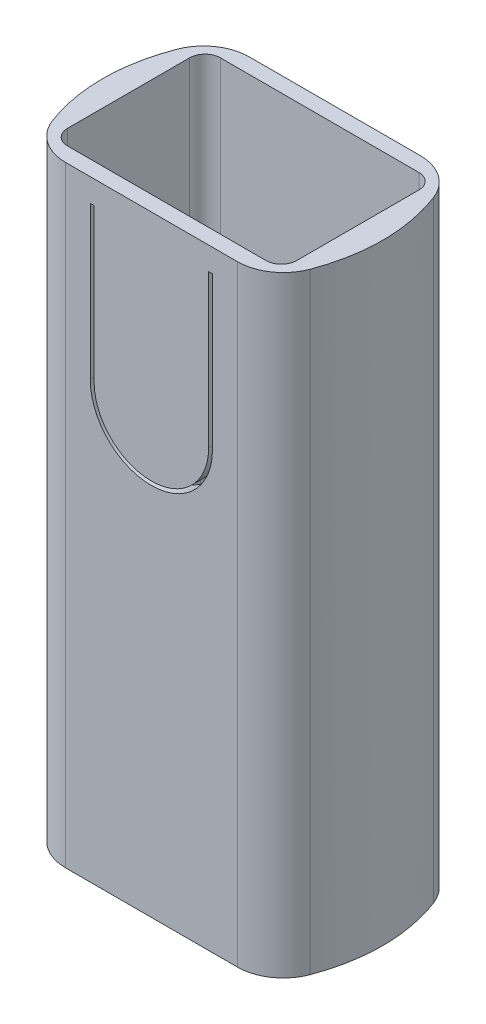
ISO-10303-21;
HEADER;
FILE_DESCRIPTION(('STEP AP214'),'2;1');
FILE_NAME('part.step','',(''),(''),'','','');
FILE_SCHEMA(('AUTOMOTIVE_DESIGN { 1 0 10303 214 1 1 1 1 }'));
ENDSEC;
DATA;
#1=APPLICATION_CONTEXT('core data for automotive mechanical design processes');
#2=APPLICATION_PROTOCOL_DEFINITION('international standard','automotive_design',2000,#1);
#3=PRODUCT_CONTEXT('',#1,'mechanical');
#4=PRODUCT('Part','Part','',(#3));
#5=PRODUCT_RELATED_PRODUCT_CATEGORY('part','',(#4));
#6=PRODUCT_DEFINITION_FORMATION('','',#4);
#7=PRODUCT_DEFINITION_CONTEXT('part definition',#1,'design');
#8=PRODUCT_DEFINITION('design','',#6,#7);
#9=PRODUCT_DEFINITION_SHAPE('','',#8);
#10=(LENGTH_UNIT() NAMED_UNIT(*) SI_UNIT(.MILLI.,.METRE.));
#11=(NAMED_UNIT(*) PLANE_ANGLE_UNIT() SI_UNIT($,.RADIAN.));
#12=(NAMED_UNIT(*) SI_UNIT($,.STERADIAN.) SOLID_ANGLE_UNIT());
#13=UNCERTAINTY_MEASURE_WITH_UNIT(LENGTH_MEASURE(1.E-05),#10,'distance_accuracy_value','');
#14=(GEOMETRIC_REPRESENTATION_CONTEXT(3) GLOBAL_UNCERTAINTY_ASSIGNED_CONTEXT((#13)) GLOBAL_UNIT_ASSIGNED_CONTEXT((#10,
#11,#12)) REPRESENTATION_CONTEXT('',''));
#15=CARTESIAN_POINT('',(0.,0.,0.));
#16=DIRECTION('',(0.,0.,1.));
#17=DIRECTION('',(1.,0.,0.));
#18=AXIS2_PLACEMENT_3D('',#15,#16,#17);
#19=CARTESIAN_POINT('',(-15.0000000000007,138.,7.9999999999995));
#20=DIRECTION('',(1.,0.,0.));
#21=DIRECTION('',(0.,0.,-1.));
#22=AXIS2_PLACEMENT_3D('',#19,#20,#21);
#23=PLANE('',#22);
#24=DIRECTION('',(0.,0.,1.));
#25=VECTOR('',#24,1.);
#26=CARTESIAN_POINT('',(-15.0000000000007,58.,7.9999999999995));
#27=LINE('',#26,#25);
#28=CARTESIAN_POINT('',(-15.0000000000007,58.,-6.93791118344121));
#29=VERTEX_POINT('',#28);
#30=CARTESIAN_POINT('',(-15.0000000000007,58.,7.9999999999995));
#31=VERTEX_POINT('',#30);
#32=EDGE_CURVE('E368',#29,#31,#27,.T.);
#33=ORIENTED_EDGE('',*,*,#32,.F.);
#34=DIRECTION('',(0.,-1.,0.));
#35=VECTOR('',#34,1.);
#36=CARTESIAN_POINT('',(-14.9999999999993,115.,-6.93791118344122));
#37=LINE('',#36,#35);
#38=CARTESIAN_POINT('',(-14.9999999999993,115.,-6.93791118344122));
#39=VERTEX_POINT('',#38);
#40=EDGE_CURVE('E301',#39,#29,#37,.T.);
#41=ORIENTED_EDGE('',*,*,#40,.F.);
#42=DIRECTION('',(0.,0.,1.));
#43=VECTOR('',#42,1.);
#44=CARTESIAN_POINT('',(-15.0000000000007,115.,7.9999999999995));
#45=LINE('',#44,#43);
#46=CARTESIAN_POINT('',(-14.9999999999993,115.,-8.0000000000005));
#47=VERTEX_POINT('',#46);
#48=EDGE_CURVE('E498',#47,#39,#45,.T.);
#49=ORIENTED_EDGE('',*,*,#48,.F.);
#50=DIRECTION('',(0.,-1.,0.));
#51=VECTOR('',#50,1.);
#52=CARTESIAN_POINT('',(-15.0000000000007,138.,-8.0000000000005));
#53=LINE('',#52,#51);
#54=CARTESIAN_POINT('',(-15.0000000000007,138.,-8.0000000000005));
#55=VERTEX_POINT('',#54);
#56=EDGE_CURVE('E382',#55,#47,#53,.T.);
#57=ORIENTED_EDGE('',*,*,#56,.F.);
#58=DIRECTION('',(0.,0.,1.));
#59=VECTOR('',#58,1.);
#60=CARTESIAN_POINT('',(-15.0000000000007,138.,7.9999999999995));
#61=LINE('',#60,#59);
#62=CARTESIAN_POINT('',(-15.0000000000007,138.,7.9999999999995));
#63=VERTEX_POINT('',#62);
#64=EDGE_CURVE('E352',#55,#63,#61,.T.);
#65=ORIENTED_EDGE('',*,*,#64,.T.);
#66=DIRECTION('',(0.,-1.,0.));
#67=VECTOR('',#66,1.);
#68=CARTESIAN_POINT('',(-15.0000000000007,138.,7.9999999999995));
#69=LINE('',#68,#67);
#70=EDGE_CURVE('E379',#63,#31,#69,.T.);
#71=ORIENTED_EDGE('',*,*,#70,.T.);
#72=EDGE_LOOP('',(#33,#41,#49,#57,#65,#71));
#73=FACE_BOUND('',#72,.T.);
#74=ADVANCED_FACE('F33',(#73),#23,.T.);
#75=CARTESIAN_POINT('',(14.9999999999993,138.,7.9999999999995));
#76=DIRECTION('',(-1.,0.,0.));
#77=DIRECTION('',(0.,0.,1.));
#78=AXIS2_PLACEMENT_3D('',#75,#76,#77);
#79=PLANE('',#78);
#80=DIRECTION('',(0.,0.,-1.));
#81=VECTOR('',#80,1.);
#82=CARTESIAN_POINT('',(14.9999999999993,115.,-10.0000000000005));
#83=LINE('',#82,#81);
#84=CARTESIAN_POINT('',(14.9999999999993,115.,-6.93791118344122));
#85=VERTEX_POINT('',#84);
#86=CARTESIAN_POINT('',(14.9999999999993,115.,-8.0000000000005));
#87=VERTEX_POINT('',#86);
#88=EDGE_CURVE('E316',#85,#87,#83,.T.);
#89=ORIENTED_EDGE('',*,*,#88,.F.);
#90=DIRECTION('',(0.,-1.,0.));
#91=VECTOR('',#90,1.);
#92=CARTESIAN_POINT('',(14.9999999999993,115.,-6.93791118344122));
#93=LINE('',#92,#91);
#94=CARTESIAN_POINT('',(14.9999999999993,58.,-6.93791118344122));
#95=VERTEX_POINT('',#94);
#96=EDGE_CURVE('E338',#85,#95,#93,.T.);
#97=ORIENTED_EDGE('',*,*,#96,.T.);
#98=DIRECTION('',(0.,0.,-1.));
#99=VECTOR('',#98,1.);
#100=CARTESIAN_POINT('',(14.9999999999993,58.,7.9999999999995));
#101=LINE('',#100,#99);
#102=CARTESIAN_POINT('',(14.9999999999993,58.,7.9999999999995));
#103=VERTEX_POINT('',#102);
#104=EDGE_CURVE('E362',#103,#95,#101,.T.);
#105=ORIENTED_EDGE('',*,*,#104,.F.);
#106=DIRECTION('',(0.,-1.,0.));
#107=VECTOR('',#106,1.);
#108=CARTESIAN_POINT('',(14.9999999999993,138.,7.9999999999995));
#109=LINE('',#108,#107);
#110=CARTESIAN_POINT('',(14.9999999999993,138.,7.9999999999995));
#111=VERTEX_POINT('',#110);
#112=EDGE_CURVE('E394',#111,#103,#109,.T.);
#113=ORIENTED_EDGE('',*,*,#112,.F.);
#114=DIRECTION('',(0.,0.,-1.));
#115=VECTOR('',#114,1.);
#116=CARTESIAN_POINT('',(14.9999999999993,138.,7.9999999999995));
#117=LINE('',#116,#115);
#118=CARTESIAN_POINT('',(14.9999999999993,138.,-8.0000000000005));
#119=VERTEX_POINT('',#118);
#120=EDGE_CURVE('E343',#111,#119,#117,.T.);
#121=ORIENTED_EDGE('',*,*,#120,.T.);
#122=DIRECTION('',(0.,-1.,0.));
#123=VECTOR('',#122,1.);
#124=CARTESIAN_POINT('',(14.9999999999993,138.,-8.0000000000005));
#125=LINE('',#124,#123);
#126=EDGE_CURVE('E391',#119,#87,#125,.T.);
#127=ORIENTED_EDGE('',*,*,#126,.T.);
#128=EDGE_LOOP('',(#89,#97,#105,#113,#121,#127));
#129=FACE_BOUND('',#128,.T.);
#130=ADVANCED_FACE('F551',(#129),#79,.T.);
#131=CARTESIAN_POINT('',(12.9999999999993,138.,-8.0000000000005));
#132=DIRECTION('',(0.,-1.,0.));
#133=DIRECTION('',(0.,0.,-1.));
#134=AXIS2_PLACEMENT_3D('',#131,#132,#133);
#135=CYLINDRICAL_SURFACE('',#134,2.);
#136=DIRECTION('',(0.,-1.,0.));
#137=VECTOR('',#136,1.);
#138=CARTESIAN_POINT('',(12.9999999999993,138.,-10.0000000000005));
#139=LINE('',#138,#137);
#140=CARTESIAN_POINT('',(12.9999999999993,138.,-10.0000000000005));
#141=VERTEX_POINT('',#140);
#142=CARTESIAN_POINT('',(12.9999999999993,115.,-10.0000000000005));
#143=VERTEX_POINT('',#142);
#144=EDGE_CURVE('E388',#141,#143,#139,.T.);
#145=ORIENTED_EDGE('',*,*,#144,.T.);
#146=CARTESIAN_POINT('',(12.9999999999993,115.,-8.0000000000005));
#147=DIRECTION('',(0.,-1.,0.));
#148=DIRECTION('',(0.,0.,-1.));
#149=AXIS2_PLACEMENT_3D('',#146,#147,#148);
#150=CIRCLE('',#149,2.);
#151=EDGE_CURVE('E496',#143,#87,#150,.T.);
#152=ORIENTED_EDGE('',*,*,#151,.T.);
#153=ORIENTED_EDGE('',*,*,#126,.F.);
#154=CARTESIAN_POINT('',(12.9999999999993,138.,-8.0000000000005));
#155=DIRECTION('',(0.,1.,0.));
#156=DIRECTION('',(0.,0.,-1.));
#157=AXIS2_PLACEMENT_3D('',#154,#155,#156);
#158=CIRCLE('',#157,2.);
#159=EDGE_CURVE('E346',#119,#141,#158,.T.);
#160=ORIENTED_EDGE('',*,*,#159,.T.);
#161=EDGE_LOOP('',(#145,#152,#153,#160));
#162=FACE_BOUND('',#161,.T.);
#163=ADVANCED_FACE('F557',(#162),#135,.F.);
#164=CARTESIAN_POINT('',(-11.1948285959103,138.,-6.00000000000053));
#165=DIRECTION('',(0.,1.,0.));
#166=DIRECTION('',(0.,0.,1.));
#167=AXIS2_PLACEMENT_3D('',#164,#165,#166);
#168=PLANE('',#167);
#169=CARTESIAN_POINT('',(-11.1948285959103,138.,-6.00000000000053));
#170=DIRECTION('',(0.,1.,0.));
#171=DIRECTION('',(0.,0.,1.));
#172=AXIS2_PLACEMENT_3D('',#169,#170,#171);
#173=CIRCLE('',#172,6.);
#174=CARTESIAN_POINT('',(-11.1948285959103,138.,-12.0000000000005));
#175=VERTEX_POINT('',#174);
#176=CARTESIAN_POINT('',(-16.8116848392168,138.,-8.10972176886679));
#177=VERTEX_POINT('',#176);
#178=EDGE_CURVE('E398',#175,#177,#173,.T.);
#179=ORIENTED_EDGE('',*,*,#178,.T.);
#180=CARTESIAN_POINT('',(-16.8116848392168,138.,-8.10972176886679));
#181=CARTESIAN_POINT('',(-17.8195265763753,138.,-5.42647593182652));
#182=CARTESIAN_POINT('',(-18.8343011976446,138.,-0.0284332988702631));
#183=CARTESIAN_POINT('',(-17.850691542806,138.,5.47265027087233));
#184=CARTESIAN_POINT('',(-16.8596172107994,138.,8.11035361792516));
#185=B_SPLINE_CURVE_WITH_KNOTS('',3,(#180,#181,#182,#183,#184),.UNSPECIFIED.,.F.,.F.,(4,1,4),
(0.167422492031923,0.502828221661461,0.83790507370678),.UNSPECIFIED.);
#186=CARTESIAN_POINT('',(-16.8596172107994,138.,8.11035361792516));
#187=VERTEX_POINT('',#186);
#188=EDGE_CURVE('E401',#177,#187,#185,.T.);
#189=ORIENTED_EDGE('',*,*,#188,.T.);
#190=CARTESIAN_POINT('',(-11.2429983339921,138.,5.99999999999947));
#191=DIRECTION('',(0.,1.,0.));
#192=DIRECTION('',(0.,0.,-1.));
#193=AXIS2_PLACEMENT_3D('',#190,#191,#192);
#194=CIRCLE('',#193,6.);
#195=CARTESIAN_POINT('',(-11.2429983339921,138.,11.9999999999995));
#196=VERTEX_POINT('',#195);
#197=EDGE_CURVE('E407',#187,#196,#194,.T.);
#198=ORIENTED_EDGE('',*,*,#197,.T.);
#199=DIRECTION('',(1.,0.,0.));
#200=VECTOR('',#199,1.);
#201=CARTESIAN_POINT('',(-11.2429983339921,138.,11.9999999999995));
#202=LINE('',#201,#200);
#203=CARTESIAN_POINT('',(11.2429983339906,138.,11.9999999999995));
#204=VERTEX_POINT('',#203);
#205=EDGE_CURVE('E618',#196,#204,#202,.T.);
#206=ORIENTED_EDGE('',*,*,#205,.T.);
#207=CARTESIAN_POINT('',(11.2429983339906,138.,5.99999999999947));
#208=DIRECTION('',(0.,1.,0.));
#209=DIRECTION('',(0.,0.,1.));
#210=AXIS2_PLACEMENT_3D('',#207,#208,#209);
#211=CIRCLE('',#210,6.);
#212=CARTESIAN_POINT('',(16.8596172107979,138.,8.11035361792516));
#213=VERTEX_POINT('',#212);
#214=EDGE_CURVE('E440',#204,#213,#211,.T.);
#215=ORIENTED_EDGE('',*,*,#214,.T.);
#216=CARTESIAN_POINT('',(16.8596172107979,138.,8.11035361792516));
#217=CARTESIAN_POINT('',(17.8506915428045,138.,5.47265027087233));
#218=CARTESIAN_POINT('',(18.8343011976432,138.,-0.0284332988702631));
#219=CARTESIAN_POINT('',(17.8195265763738,138.,-5.42647593182652));
#220=CARTESIAN_POINT('',(16.8116848392153,138.,-8.10972176886679));
#221=B_SPLINE_CURVE_WITH_KNOTS('',3,(#216,#217,#218,#219,#220),.UNSPECIFIED.,.F.,.F.,(4,1,4),
(0.167422492031923,0.502499344077242,0.83790507370678),.UNSPECIFIED.);
#222=CARTESIAN_POINT('',(16.8116848392153,138.,-8.10972176886679));
#223=VERTEX_POINT('',#222);
#224=EDGE_CURVE('E433',#213,#223,#221,.T.);
#225=ORIENTED_EDGE('',*,*,#224,.T.);
#226=CARTESIAN_POINT('',(11.1948285959088,138.,-6.00000000000053));
#227=DIRECTION('',(0.,1.,0.));
#228=DIRECTION('',(0.,0.,-1.));
#229=AXIS2_PLACEMENT_3D('',#226,#227,#228);
#230=CIRCLE('',#229,6.);
#231=CARTESIAN_POINT('',(11.1948285959088,138.,-12.0000000000005));
#232=VERTEX_POINT('',#231);
#233=EDGE_CURVE('E439',#223,#232,#230,.T.);
#234=ORIENTED_EDGE('',*,*,#233,.T.);
#235=DIRECTION('',(-1.,0.,0.));
#236=VECTOR('',#235,1.);
#237=CARTESIAN_POINT('',(-11.1948285959103,138.,-12.0000000000005));
#238=LINE('',#237,#236);
#239=EDGE_CURVE('E445',#232,#175,#238,.T.);
#240=ORIENTED_EDGE('',*,*,#239,.T.);
#241=EDGE_LOOP('',(#179,#189,#198,#206,#215,#225,#234,#240));
#242=FACE_BOUND('',#241,.T.);
#243=ORIENTED_EDGE('',*,*,#120,.F.);
#244=CARTESIAN_POINT('',(12.9999999999993,138.,7.9999999999995));
#245=DIRECTION('',(0.,1.,0.));
#246=DIRECTION('',(0.,0.,-1.));
#247=AXIS2_PLACEMENT_3D('',#244,#245,#246);
#248=CIRCLE('',#247,2.);
#249=CARTESIAN_POINT('',(12.9999999999993,138.,9.9999999999995));
#250=VERTEX_POINT('',#249);
#251=EDGE_CURVE('E341',#250,#111,#248,.T.);
#252=ORIENTED_EDGE('',*,*,#251,.F.);
#253=DIRECTION('',(1.,0.,0.));
#254=VECTOR('',#253,1.);
#255=CARTESIAN_POINT('',(-13.0000000000007,138.,9.9999999999995));
#256=LINE('',#255,#254);
#257=CARTESIAN_POINT('',(-13.0000000000007,138.,9.9999999999995));
#258=VERTEX_POINT('',#257);
#259=EDGE_CURVE('E357',#258,#250,#256,.T.);
#260=ORIENTED_EDGE('',*,*,#259,.F.);
#261=CARTESIAN_POINT('',(-13.0000000000007,138.,7.9999999999995));
#262=DIRECTION('',(0.,1.,0.));
#263=DIRECTION('',(0.,0.,1.));
#264=AXIS2_PLACEMENT_3D('',#261,#262,#263);
#265=CIRCLE('',#264,2.);
#266=EDGE_CURVE('E354',#63,#258,#265,.T.);
#267=ORIENTED_EDGE('',*,*,#266,.F.);
#268=ORIENTED_EDGE('',*,*,#64,.F.);
#269=CARTESIAN_POINT('',(-13.0000000000007,138.,-8.0000000000005));
#270=DIRECTION('',(0.,1.,0.));
#271=DIRECTION('',(0.,0.,1.));
#272=AXIS2_PLACEMENT_3D('',#269,#270,#271);
#273=CIRCLE('',#272,2.);
#274=CARTESIAN_POINT('',(-13.0000000000007,138.,-10.0000000000005));
#275=VERTEX_POINT('',#274);
#276=EDGE_CURVE('E350',#275,#55,#273,.T.);
#277=ORIENTED_EDGE('',*,*,#276,.F.);
#278=DIRECTION('',(-1.,0.,0.));
#279=VECTOR('',#278,1.);
#280=CARTESIAN_POINT('',(-13.0000000000007,138.,-10.0000000000005));
#281=LINE('',#280,#279);
#282=EDGE_CURVE('E348',#141,#275,#281,.T.);
#283=ORIENTED_EDGE('',*,*,#282,.F.);
#284=ORIENTED_EDGE('',*,*,#159,.F.);
#285=EDGE_LOOP('',(#243,#252,#260,#267,#268,#277,#283,#284));
#286=FACE_BOUND('',#285,.T.);
#287=ADVANCED_FACE('F575',(#242,#286),#168,.T.);
#288=CARTESIAN_POINT('',(-11.1948285959103,58.,-6.00000000000053));
#289=DIRECTION('',(0.,1.,0.));
#290=DIRECTION('',(0.,0.,1.));
#291=AXIS2_PLACEMENT_3D('',#288,#289,#290);
#292=PLANE('',#291);
#293=DIRECTION('',(-1.,0.,0.));
#294=VECTOR('',#293,1.);
#295=CARTESIAN_POINT('',(-13.0000000000007,58.,-10.0000000000005));
#296=LINE('',#295,#294);
#297=CARTESIAN_POINT('',(13.0000000000015,58.,-10.0000000000005));
#298=VERTEX_POINT('',#297);
#299=CARTESIAN_POINT('',(-13.0000000000015,58.,-10.0000000000005));
#300=VERTEX_POINT('',#299);
#301=EDGE_CURVE('E365',#298,#300,#296,.T.);
#302=ORIENTED_EDGE('',*,*,#301,.T.);
#303=DIRECTION('',(0.,0.,-1.));
#304=VECTOR('',#303,1.);
#305=CARTESIAN_POINT('',(-13.0000000000015,58.,-7.43791118344122));
#306=LINE('',#305,#304);
#307=CARTESIAN_POINT('',(-13.0000000000015,58.,-7.43791118344122));
#308=VERTEX_POINT('',#307);
#309=EDGE_CURVE('E296',#308,#300,#306,.T.);
#310=ORIENTED_EDGE('',*,*,#309,.F.);
#311=CARTESIAN_POINT('',(-13.5000000000015,58.,-7.43791118344122));
#312=DIRECTION('',(0.,1.,0.));
#313=DIRECTION('',(0.,0.,1.));
#314=AXIS2_PLACEMENT_3D('',#311,#312,#313);
#315=CIRCLE('',#314,0.5);
#316=CARTESIAN_POINT('',(-13.5000000000015,58.,-6.93791118344122));
#317=VERTEX_POINT('',#316);
#318=EDGE_CURVE('E274',#317,#308,#315,.T.);
#319=ORIENTED_EDGE('',*,*,#318,.F.);
#320=DIRECTION('',(1.,0.,0.));
#321=VECTOR('',#320,1.);
#322=CARTESIAN_POINT('',(-14.9999999999993,58.,-6.93791118344122));
#323=LINE('',#322,#321);
#324=EDGE_CURVE('E289',#29,#317,#323,.T.);
#325=ORIENTED_EDGE('',*,*,#324,.F.);
#326=ORIENTED_EDGE('',*,*,#32,.T.);
#327=CARTESIAN_POINT('',(-13.0000000000007,58.,7.9999999999995));
#328=DIRECTION('',(0.,1.,0.));
#329=DIRECTION('',(0.,0.,1.));
#330=AXIS2_PLACEMENT_3D('',#327,#328,#329);
#331=CIRCLE('',#330,2.);
#332=CARTESIAN_POINT('',(-13.0000000000007,58.,9.99999999999951));
#333=VERTEX_POINT('',#332);
#334=EDGE_CURVE('E370',#31,#333,#331,.T.);
#335=ORIENTED_EDGE('',*,*,#334,.T.);
#336=DIRECTION('',(1.,0.,0.));
#337=VECTOR('',#336,1.);
#338=CARTESIAN_POINT('',(-13.0000000000007,58.,9.9999999999995));
#339=LINE('',#338,#337);
#340=CARTESIAN_POINT('',(12.9999999999993,58.,9.9999999999995));
#341=VERTEX_POINT('',#340);
#342=EDGE_CURVE('E344',#333,#341,#339,.T.);
#343=ORIENTED_EDGE('',*,*,#342,.T.);
#344=CARTESIAN_POINT('',(12.9999999999993,58.,7.9999999999995));
#345=DIRECTION('',(0.,1.,0.));
#346=DIRECTION('',(0.,0.,-1.));
#347=AXIS2_PLACEMENT_3D('',#344,#345,#346);
#348=CIRCLE('',#347,2.);
#349=EDGE_CURVE('E340',#341,#103,#348,.T.);
#350=ORIENTED_EDGE('',*,*,#349,.T.);
#351=ORIENTED_EDGE('',*,*,#104,.T.);
#352=DIRECTION('',(1.,0.,0.));
#353=VECTOR('',#352,1.);
#354=CARTESIAN_POINT('',(14.9999999999993,58.,-6.93791118344122));
#355=LINE('',#354,#353);
#356=CARTESIAN_POINT('',(13.5000000000015,58.,-6.93791118344122));
#357=VERTEX_POINT('',#356);
#358=EDGE_CURVE('E312',#357,#95,#355,.T.);
#359=ORIENTED_EDGE('',*,*,#358,.F.);
#360=CARTESIAN_POINT('',(13.5000000000015,58.,-7.43791118344122));
#361=DIRECTION('',(0.,1.,0.));
#362=DIRECTION('',(0.,0.,-1.));
#363=AXIS2_PLACEMENT_3D('',#360,#361,#362);
#364=CIRCLE('',#363,0.5);
#365=CARTESIAN_POINT('',(13.0000000000015,58.,-7.43791118344122));
#366=VERTEX_POINT('',#365);
#367=EDGE_CURVE('E317',#366,#357,#364,.T.);
#368=ORIENTED_EDGE('',*,*,#367,.F.);
#369=DIRECTION('',(0.,0.,1.));
#370=VECTOR('',#369,1.);
#371=CARTESIAN_POINT('',(13.0000000000015,58.,-7.43791118344122));
#372=LINE('',#371,#370);
#373=EDGE_CURVE('E327',#298,#366,#372,.T.);
#374=ORIENTED_EDGE('',*,*,#373,.F.);
#375=EDGE_LOOP('',(#302,#310,#319,#325,#326,#335,#343,#350,#351,#359,#368,#374));
#376=FACE_BOUND('',#375,.T.);
#377=CARTESIAN_POINT('',(-11.1948285959103,58.,-6.00000000000053));
#378=DIRECTION('',(0.,1.,0.));
#379=DIRECTION('',(0.,0.,1.));
#380=AXIS2_PLACEMENT_3D('',#377,#378,#379);
#381=CIRCLE('',#380,6.);
#382=CARTESIAN_POINT('',(-11.1948285959103,58.,-12.0000000000005));
#383=VERTEX_POINT('',#382);
#384=CARTESIAN_POINT('',(-16.8116848392168,58.,-8.10972176886679));
#385=VERTEX_POINT('',#384);
#386=EDGE_CURVE('E397',#383,#385,#381,.T.);
#387=ORIENTED_EDGE('',*,*,#386,.F.);
#388=DIRECTION('',(-1.,0.,0.));
#389=VECTOR('',#388,1.);
#390=CARTESIAN_POINT('',(-11.1948285959103,58.,-12.0000000000005));
#391=LINE('',#390,#389);
#392=CARTESIAN_POINT('',(11.1948285959088,58.,-12.0000000000005));
#393=VERTEX_POINT('',#392);
#394=EDGE_CURVE('E402',#393,#383,#391,.T.);
#395=ORIENTED_EDGE('',*,*,#394,.F.);
#396=CARTESIAN_POINT('',(11.1948285959088,58.,-6.00000000000053));
#397=DIRECTION('',(0.,1.,0.));
#398=DIRECTION('',(0.,0.,-1.));
#399=AXIS2_PLACEMENT_3D('',#396,#397,#398);
#400=CIRCLE('',#399,6.);
#401=CARTESIAN_POINT('',(16.8116848392153,58.,-8.10972176886679));
#402=VERTEX_POINT('',#401);
#403=EDGE_CURVE('E467',#402,#393,#400,.T.);
#404=ORIENTED_EDGE('',*,*,#403,.F.);
#405=CARTESIAN_POINT('',(16.8596172107979,58.,8.11035361792516));
#406=CARTESIAN_POINT('',(17.8506915428045,58.,5.47265027087233));
#407=CARTESIAN_POINT('',(18.8343011976432,58.,-0.0284332988702631));
#408=CARTESIAN_POINT('',(17.8195265763738,58.,-5.42647593182652));
#409=CARTESIAN_POINT('',(16.8116848392153,58.,-8.10972176886679));
#410=B_SPLINE_CURVE_WITH_KNOTS('',3,(#405,#406,#407,#408,#409),.UNSPECIFIED.,.F.,.F.,(4,1,4),
(0.167422492031923,0.502499344077242,0.83790507370678),.UNSPECIFIED.);
#411=CARTESIAN_POINT('',(16.8596172107979,58.,8.11035361792516));
#412=VERTEX_POINT('',#411);
#413=EDGE_CURVE('E463',#412,#402,#410,.T.);
#414=ORIENTED_EDGE('',*,*,#413,.F.);
#415=CARTESIAN_POINT('',(11.2429983339906,58.,5.99999999999947));
#416=DIRECTION('',(0.,1.,0.));
#417=DIRECTION('',(0.,0.,1.));
#418=AXIS2_PLACEMENT_3D('',#415,#416,#417);
#419=CIRCLE('',#418,6.);
#420=CARTESIAN_POINT('',(11.2429983339906,58.,11.9999999999995));
#421=VERTEX_POINT('',#420);
#422=EDGE_CURVE('E461',#421,#412,#419,.T.);
#423=ORIENTED_EDGE('',*,*,#422,.F.);
#424=DIRECTION('',(1.,0.,0.));
#425=VECTOR('',#424,1.);
#426=CARTESIAN_POINT('',(-11.2429983339921,58.,11.9999999999995));
#427=LINE('',#426,#425);
#428=CARTESIAN_POINT('',(-11.2429983339921,58.,11.9999999999995));
#429=VERTEX_POINT('',#428);
#430=EDGE_CURVE('E459',#429,#421,#427,.T.);
#431=ORIENTED_EDGE('',*,*,#430,.F.);
#432=CARTESIAN_POINT('',(-11.2429983339921,58.,5.99999999999947));
#433=DIRECTION('',(0.,1.,0.));
#434=DIRECTION('',(0.,0.,-1.));
#435=AXIS2_PLACEMENT_3D('',#432,#433,#434);
#436=CIRCLE('',#435,6.);
#437=CARTESIAN_POINT('',(-16.8596172107994,58.,8.11035361792516));
#438=VERTEX_POINT('',#437);
#439=EDGE_CURVE('E454',#438,#429,#436,.T.);
#440=ORIENTED_EDGE('',*,*,#439,.F.);
#441=CARTESIAN_POINT('',(-16.8116848392168,58.,-8.10972176886679));
#442=CARTESIAN_POINT('',(-17.8195265763753,58.,-5.42647593182652));
#443=CARTESIAN_POINT('',(-18.8343011976446,58.,-0.0284332988702631));
#444=CARTESIAN_POINT('',(-17.850691542806,58.,5.47265027087233));
#445=CARTESIAN_POINT('',(-16.8596172107994,58.,8.11035361792516));
#446=B_SPLINE_CURVE_WITH_KNOTS('',3,(#441,#442,#443,#444,#445),.UNSPECIFIED.,.F.,.F.,(4,1,4),
(0.167422492031923,0.502828221661461,0.83790507370678),.UNSPECIFIED.);
#447=EDGE_CURVE('E450',#385,#438,#446,.T.);
#448=ORIENTED_EDGE('',*,*,#447,.F.);
#449=EDGE_LOOP('',(#387,#395,#404,#414,#423,#431,#440,#448));
#450=FACE_BOUND('',#449,.T.);
#451=ADVANCED_FACE('F584',(#376,#450),#292,.F.);
#452=CARTESIAN_POINT('',(-11.1948285959103,138.,-6.00000000000053));
#453=DIRECTION('',(0.,-1.,0.));
#454=DIRECTION('',(0.,0.,-1.));
#455=AXIS2_PLACEMENT_3D('',#452,#453,#454);
#456=CYLINDRICAL_SURFACE('',#455,6.);
#457=ORIENTED_EDGE('',*,*,#386,.T.);
#458=DIRECTION('',(0.,-1.,0.));
#459=VECTOR('',#458,1.);
#460=CARTESIAN_POINT('',(-16.8116848392168,138.,-8.10972176886679));
#461=LINE('',#460,#459);
#462=EDGE_CURVE('E493',#177,#385,#461,.T.);
#463=ORIENTED_EDGE('',*,*,#462,.F.);
#464=ORIENTED_EDGE('',*,*,#178,.F.);
#465=DIRECTION('',(0.,-1.,0.));
#466=VECTOR('',#465,1.);
#467=CARTESIAN_POINT('',(-11.1948285959103,138.,-12.0000000000005));
#468=LINE('',#467,#466);
#469=EDGE_CURVE('E447',#175,#383,#468,.T.);
#470=ORIENTED_EDGE('',*,*,#469,.T.);
#471=EDGE_LOOP('',(#457,#463,#464,#470));
#472=FACE_BOUND('',#471,.T.);
#473=ADVANCED_FACE('F35',(#472),#456,.T.);
#474=DIRECTION('',(0.,-1.,0.));
#475=VECTOR('',#474,1.);
#476=SURFACE_OF_LINEAR_EXTRUSION('',#185,#475);
#477=ORIENTED_EDGE('',*,*,#447,.T.);
#478=DIRECTION('',(0.,-1.,0.));
#479=VECTOR('',#478,1.);
#480=CARTESIAN_POINT('',(-16.8596172107994,138.,8.11035361792516));
#481=LINE('',#480,#479);
#482=EDGE_CURVE('E490',#187,#438,#481,.T.);
#483=ORIENTED_EDGE('',*,*,#482,.F.);
#484=ORIENTED_EDGE('',*,*,#188,.F.);
#485=ORIENTED_EDGE('',*,*,#462,.T.);
#486=EDGE_LOOP('',(#477,#483,#484,#485));
#487=FACE_BOUND('',#486,.T.);
#488=ADVANCED_FACE('F412',(#487),#476,.F.);
#489=CARTESIAN_POINT('',(-11.2429983339921,138.,5.99999999999947));
#490=DIRECTION('',(0.,-1.,0.));
#491=DIRECTION('',(0.,0.,-1.));
#492=AXIS2_PLACEMENT_3D('',#489,#490,#491);
#493=CYLINDRICAL_SURFACE('',#492,6.);
#494=ORIENTED_EDGE('',*,*,#439,.T.);
#495=DIRECTION('',(0.,-1.,0.));
#496=VECTOR('',#495,1.);
#497=CARTESIAN_POINT('',(-11.2429983339921,138.,11.9999999999995));
#498=LINE('',#497,#496);
#499=EDGE_CURVE('E487',#196,#429,#498,.T.);
#500=ORIENTED_EDGE('',*,*,#499,.F.);
#501=ORIENTED_EDGE('',*,*,#197,.F.);
#502=ORIENTED_EDGE('',*,*,#482,.T.);
#503=EDGE_LOOP('',(#494,#500,#501,#502));
#504=FACE_BOUND('',#503,.T.);
#505=ADVANCED_FACE('F415',(#504),#493,.T.);
#506=CARTESIAN_POINT('',(-11.2429983339921,138.,11.9999999999995));
#507=DIRECTION('',(0.,0.,-1.));
#508=DIRECTION('',(-1.,0.,0.));
#509=AXIS2_PLACEMENT_3D('',#506,#507,#508);
#510=PLANE('',#509);
#511=DIRECTION('',(0.,-1.,0.));
#512=VECTOR('',#511,1.);
#513=CARTESIAN_POINT('',(7.47635773627962,134.986611491829,11.9999999999995));
#514=LINE('',#513,#512);
#515=CARTESIAN_POINT('',(7.47635773627962,134.986611491829,11.9999999999995));
#516=VERTEX_POINT('',#515);
#517=CARTESIAN_POINT('',(7.47635773627963,114.986611491829,11.9999999999995));
#518=VERTEX_POINT('',#517);
#519=EDGE_CURVE('E247',#516,#518,#514,.T.);
#520=ORIENTED_EDGE('',*,*,#519,.F.);
#521=DIRECTION('',(-1.,0.,0.));
#522=VECTOR('',#521,1.);
#523=CARTESIAN_POINT('',(7.47635773627962,134.986611491829,11.9999999999995));
#524=LINE('',#523,#522);
#525=CARTESIAN_POINT('',(7.97635773627962,134.986611491829,11.9999999999995));
#526=VERTEX_POINT('',#525);
#527=EDGE_CURVE('E48',#526,#516,#524,.T.);
#528=ORIENTED_EDGE('',*,*,#527,.F.);
#529=DIRECTION('',(0.,1.,0.));
#530=VECTOR('',#529,1.);
#531=CARTESIAN_POINT('',(7.97635773627962,134.986611491829,11.9999999999995));
#532=LINE('',#531,#530);
#533=CARTESIAN_POINT('',(7.97635773627963,114.986611491829,11.9999999999995));
#534=VERTEX_POINT('',#533);
#535=EDGE_CURVE('E269',#534,#526,#532,.T.);
#536=ORIENTED_EDGE('',*,*,#535,.F.);
#537=CARTESIAN_POINT('',(-0.0236422637203737,114.986611491829,11.9999999999995));
#538=DIRECTION('',(0.,0.,1.));
#539=DIRECTION('',(-1.,0.,0.));
#540=AXIS2_PLACEMENT_3D('',#537,#538,#539);
#541=CIRCLE('',#540,8.);
#542=CARTESIAN_POINT('',(-8.02364226372038,114.986611491829,11.9999999999995));
#543=VERTEX_POINT('',#542);
#544=EDGE_CURVE('E266',#543,#534,#541,.T.);
#545=ORIENTED_EDGE('',*,*,#544,.F.);
#546=DIRECTION('',(0.,-1.,0.));
#547=VECTOR('',#546,1.);
#548=CARTESIAN_POINT('',(-8.02364226372038,114.986611491829,11.9999999999995));
#549=LINE('',#548,#547);
#550=CARTESIAN_POINT('',(-8.02364226372037,134.986611491829,11.9999999999995));
#551=VERTEX_POINT('',#550);
#552=EDGE_CURVE('E263',#551,#543,#549,.T.);
#553=ORIENTED_EDGE('',*,*,#552,.F.);
#554=DIRECTION('',(-1.,0.,0.));
#555=VECTOR('',#554,1.);
#556=CARTESIAN_POINT('',(-8.02364226372037,134.986611491829,11.9999999999995));
#557=LINE('',#556,#555);
#558=CARTESIAN_POINT('',(-7.52364226372038,134.986611491829,11.9999999999995));
#559=VERTEX_POINT('',#558);
#560=EDGE_CURVE('E257',#559,#551,#557,.T.);
#561=ORIENTED_EDGE('',*,*,#560,.F.);
#562=DIRECTION('',(0.,1.,0.));
#563=VECTOR('',#562,1.);
#564=CARTESIAN_POINT('',(-7.52364226372038,134.986611491829,11.9999999999995));
#565=LINE('',#564,#563);
#566=CARTESIAN_POINT('',(-7.52364226372037,114.986611491829,11.9999999999995));
#567=VERTEX_POINT('',#566);
#568=EDGE_CURVE('E255',#567,#559,#565,.T.);
#569=ORIENTED_EDGE('',*,*,#568,.F.);
#570=CARTESIAN_POINT('',(-0.0236422637203736,114.986611491829,11.9999999999995));
#571=DIRECTION('',(0.,0.,-1.));
#572=DIRECTION('',(-1.,0.,0.));
#573=AXIS2_PLACEMENT_3D('',#570,#571,#572);
#574=CIRCLE('',#573,7.5);
#575=EDGE_CURVE('E238',#518,#567,#574,.T.);
#576=ORIENTED_EDGE('',*,*,#575,.F.);
#577=EDGE_LOOP('',(#520,#528,#536,#545,#553,#561,#569,#576));
#578=FACE_BOUND('',#577,.T.);
#579=ORIENTED_EDGE('',*,*,#430,.T.);
#580=DIRECTION('',(0.,-1.,0.));
#581=VECTOR('',#580,1.);
#582=CARTESIAN_POINT('',(11.2429983339906,138.,11.9999999999995));
#583=LINE('',#582,#581);
#584=EDGE_CURVE('E484',#204,#421,#583,.T.);
#585=ORIENTED_EDGE('',*,*,#584,.F.);
#586=ORIENTED_EDGE('',*,*,#205,.F.);
#587=ORIENTED_EDGE('',*,*,#499,.T.);
#588=EDGE_LOOP('',(#579,#585,#586,#587));
#589=FACE_BOUND('',#588,.T.);
#590=ADVANCED_FACE('F251',(#578,#589),#510,.F.);
#591=CARTESIAN_POINT('',(11.2429983339906,138.,5.99999999999947));
#592=DIRECTION('',(0.,-1.,0.));
#593=DIRECTION('',(0.,0.,-1.));
#594=AXIS2_PLACEMENT_3D('',#591,#592,#593);
#595=CYLINDRICAL_SURFACE('',#594,6.);
#596=ORIENTED_EDGE('',*,*,#422,.T.);
#597=DIRECTION('',(0.,-1.,0.));
#598=VECTOR('',#597,1.);
#599=CARTESIAN_POINT('',(16.8596172107979,138.,8.11035361792516));
#600=LINE('',#599,#598);
#601=EDGE_CURVE('E481',#213,#412,#600,.T.);
#602=ORIENTED_EDGE('',*,*,#601,.F.);
#603=ORIENTED_EDGE('',*,*,#214,.F.);
#604=ORIENTED_EDGE('',*,*,#584,.T.);
#605=EDGE_LOOP('',(#596,#602,#603,#604));
#606=FACE_BOUND('',#605,.T.);
#607=ADVANCED_FACE('F422',(#606),#595,.T.);
#608=DIRECTION('',(0.,-1.,0.));
#609=VECTOR('',#608,1.);
#610=SURFACE_OF_LINEAR_EXTRUSION('',#221,#609);
#611=ORIENTED_EDGE('',*,*,#413,.T.);
#612=DIRECTION('',(0.,-1.,0.));
#613=VECTOR('',#612,1.);
#614=CARTESIAN_POINT('',(16.8116848392153,138.,-8.10972176886679));
#615=LINE('',#614,#613);
#616=EDGE_CURVE('E478',#223,#402,#615,.T.);
#617=ORIENTED_EDGE('',*,*,#616,.F.);
#618=ORIENTED_EDGE('',*,*,#224,.F.);
#619=ORIENTED_EDGE('',*,*,#601,.T.);
#620=EDGE_LOOP('',(#611,#617,#618,#619));
#621=FACE_BOUND('',#620,.T.);
#622=ADVANCED_FACE('F425',(#621),#610,.F.);
#623=CARTESIAN_POINT('',(11.1948285959088,138.,-6.00000000000053));
#624=DIRECTION('',(0.,-1.,0.));
#625=DIRECTION('',(0.,0.,-1.));
#626=AXIS2_PLACEMENT_3D('',#623,#624,#625);
#627=CYLINDRICAL_SURFACE('',#626,6.);
#628=ORIENTED_EDGE('',*,*,#403,.T.);
#629=DIRECTION('',(0.,-1.,0.));
#630=VECTOR('',#629,1.);
#631=CARTESIAN_POINT('',(11.1948285959088,138.,-12.0000000000005));
#632=LINE('',#631,#630);
#633=EDGE_CURVE('E475',#232,#393,#632,.T.);
#634=ORIENTED_EDGE('',*,*,#633,.F.);
#635=ORIENTED_EDGE('',*,*,#233,.F.);
#636=ORIENTED_EDGE('',*,*,#616,.T.);
#637=EDGE_LOOP('',(#628,#634,#635,#636));
#638=FACE_BOUND('',#637,.T.);
#639=ADVANCED_FACE('F430',(#638),#627,.T.);
#640=CARTESIAN_POINT('',(-11.1948285959103,138.,-12.0000000000005));
#641=DIRECTION('',(0.,0.,1.));
#642=DIRECTION('',(1.,0.,0.));
#643=AXIS2_PLACEMENT_3D('',#640,#641,#642);
#644=PLANE('',#643);
#645=ORIENTED_EDGE('',*,*,#394,.T.);
#646=ORIENTED_EDGE('',*,*,#469,.F.);
#647=ORIENTED_EDGE('',*,*,#239,.F.);
#648=ORIENTED_EDGE('',*,*,#633,.T.);
#649=EDGE_LOOP('',(#645,#646,#647,#648));
#650=FACE_BOUND('',#649,.T.);
#651=ADVANCED_FACE('F580',(#650),#644,.F.);
#652=CARTESIAN_POINT('',(12.9999999999993,138.,7.9999999999995));
#653=DIRECTION('',(0.,-1.,0.));
#654=DIRECTION('',(0.,0.,-1.));
#655=AXIS2_PLACEMENT_3D('',#652,#653,#654);
#656=CYLINDRICAL_SURFACE('',#655,2.);
#657=ORIENTED_EDGE('',*,*,#349,.F.);
#658=DIRECTION('',(0.,-1.,0.));
#659=VECTOR('',#658,1.);
#660=CARTESIAN_POINT('',(12.9999999999993,138.,9.9999999999995));
#661=LINE('',#660,#659);
#662=EDGE_CURVE('E359',#250,#341,#661,.T.);
#663=ORIENTED_EDGE('',*,*,#662,.F.);
#664=ORIENTED_EDGE('',*,*,#251,.T.);
#665=ORIENTED_EDGE('',*,*,#112,.T.);
#666=EDGE_LOOP('',(#657,#663,#664,#665));
#667=FACE_BOUND('',#666,.T.);
#668=ADVANCED_FACE('F572',(#667),#656,.F.);
#669=CARTESIAN_POINT('',(-13.0000000000007,138.,-10.0000000000005));
#670=DIRECTION('',(0.,0.,1.));
#671=DIRECTION('',(1.,0.,0.));
#672=AXIS2_PLACEMENT_3D('',#669,#670,#671);
#673=PLANE('',#672);
#674=ORIENTED_EDGE('',*,*,#301,.F.);
#675=DIRECTION('',(0.,-1.,0.));
#676=VECTOR('',#675,1.);
#677=CARTESIAN_POINT('',(13.0000000000015,115.,-10.0000000000005));
#678=LINE('',#677,#676);
#679=EDGE_CURVE('E335',#143,#298,#678,.T.);
#680=ORIENTED_EDGE('',*,*,#679,.F.);
#681=ORIENTED_EDGE('',*,*,#144,.F.);
#682=ORIENTED_EDGE('',*,*,#282,.T.);
#683=DIRECTION('',(0.,-1.,0.));
#684=VECTOR('',#683,1.);
#685=CARTESIAN_POINT('',(-13.0000000000007,138.,-10.0000000000005));
#686=LINE('',#685,#684);
#687=CARTESIAN_POINT('',(-13.0000000000015,115.,-10.0000000000005));
#688=VERTEX_POINT('',#687);
#689=EDGE_CURVE('E385',#275,#688,#686,.T.);
#690=ORIENTED_EDGE('',*,*,#689,.T.);
#691=DIRECTION('',(0.,-1.,0.));
#692=VECTOR('',#691,1.);
#693=CARTESIAN_POINT('',(-13.0000000000015,115.,-10.0000000000005));
#694=LINE('',#693,#692);
#695=EDGE_CURVE('E304',#688,#300,#694,.T.);
#696=ORIENTED_EDGE('',*,*,#695,.T.);
#697=EDGE_LOOP('',(#674,#680,#681,#682,#690,#696));
#698=FACE_BOUND('',#697,.T.);
#699=ADVANCED_FACE('F568',(#698),#673,.T.);
#700=CARTESIAN_POINT('',(-13.0000000000007,138.,-8.0000000000005));
#701=DIRECTION('',(0.,-1.,0.));
#702=DIRECTION('',(0.,0.,-1.));
#703=AXIS2_PLACEMENT_3D('',#700,#701,#702);
#704=CYLINDRICAL_SURFACE('',#703,2.);
#705=CARTESIAN_POINT('',(-13.0000000000007,115.,-8.0000000000005));
#706=DIRECTION('',(0.,1.,0.));
#707=DIRECTION('',(0.,0.,1.));
#708=AXIS2_PLACEMENT_3D('',#705,#706,#707);
#709=CIRCLE('',#708,2.);
#710=EDGE_CURVE('E310',#688,#47,#709,.T.);
#711=ORIENTED_EDGE('',*,*,#710,.F.);
#712=ORIENTED_EDGE('',*,*,#689,.F.);
#713=ORIENTED_EDGE('',*,*,#276,.T.);
#714=ORIENTED_EDGE('',*,*,#56,.T.);
#715=EDGE_LOOP('',(#711,#712,#713,#714));
#716=FACE_BOUND('',#715,.T.);
#717=ADVANCED_FACE('F565',(#716),#704,.F.);
#718=CARTESIAN_POINT('',(-13.0000000000007,138.,7.9999999999995));
#719=DIRECTION('',(0.,-1.,0.));
#720=DIRECTION('',(0.,0.,-1.));
#721=AXIS2_PLACEMENT_3D('',#718,#719,#720);
#722=CYLINDRICAL_SURFACE('',#721,2.);
#723=ORIENTED_EDGE('',*,*,#334,.F.);
#724=ORIENTED_EDGE('',*,*,#70,.F.);
#725=ORIENTED_EDGE('',*,*,#266,.T.);
#726=DIRECTION('',(0.,-1.,0.));
#727=VECTOR('',#726,1.);
#728=CARTESIAN_POINT('',(-13.0000000000007,138.,9.99999999999951));
#729=LINE('',#728,#727);
#730=EDGE_CURVE('E377',#258,#333,#729,.T.);
#731=ORIENTED_EDGE('',*,*,#730,.T.);
#732=EDGE_LOOP('',(#723,#724,#725,#731));
#733=FACE_BOUND('',#732,.T.);
#734=ADVANCED_FACE('F563',(#733),#722,.F.);
#735=CARTESIAN_POINT('',(-13.0000000000007,138.,9.9999999999995));
#736=DIRECTION('',(0.,0.,-1.));
#737=DIRECTION('',(-1.,0.,0.));
#738=AXIS2_PLACEMENT_3D('',#735,#736,#737);
#739=PLANE('',#738);
#740=DIRECTION('',(1.,0.,0.));
#741=VECTOR('',#740,1.);
#742=CARTESIAN_POINT('',(-13.0000000000006,134.986611491828,9.9999999999995));
#743=LINE('',#742,#741);
#744=CARTESIAN_POINT('',(7.47635773627962,134.986611491829,9.9999999999995));
#745=VERTEX_POINT('',#744);
#746=CARTESIAN_POINT('',(7.97635773627962,134.986611491829,9.9999999999995));
#747=VERTEX_POINT('',#746);
#748=EDGE_CURVE('E11',#745,#747,#743,.T.);
#749=ORIENTED_EDGE('',*,*,#748,.F.);
#750=DIRECTION('',(0.,1.,0.));
#751=VECTOR('',#750,1.);
#752=CARTESIAN_POINT('',(7.47635773627962,138.,9.9999999999995));
#753=LINE('',#752,#751);
#754=CARTESIAN_POINT('',(7.47635773627963,114.986611491829,9.9999999999995));
#755=VERTEX_POINT('',#754);
#756=EDGE_CURVE('E500',#755,#745,#753,.T.);
#757=ORIENTED_EDGE('',*,*,#756,.F.);
#758=CARTESIAN_POINT('',(-0.0236422637203736,114.986611491829,9.9999999999995));
#759=DIRECTION('',(0.,0.,-1.));
#760=DIRECTION('',(-1.,0.,0.));
#761=AXIS2_PLACEMENT_3D('',#758,#759,#760);
#762=CIRCLE('',#761,7.5);
#763=CARTESIAN_POINT('',(-7.52364226372037,114.986611491829,9.9999999999995));
#764=VERTEX_POINT('',#763);
#765=EDGE_CURVE('E241',#764,#755,#762,.F.);
#766=ORIENTED_EDGE('',*,*,#765,.F.);
#767=DIRECTION('',(0.,-1.,0.));
#768=VECTOR('',#767,1.);
#769=CARTESIAN_POINT('',(-7.52364226372038,138.,9.9999999999995));
#770=LINE('',#769,#768);
#771=CARTESIAN_POINT('',(-7.52364226372038,134.986611491829,9.9999999999995));
#772=VERTEX_POINT('',#771);
#773=EDGE_CURVE('E503',#772,#764,#770,.T.);
#774=ORIENTED_EDGE('',*,*,#773,.F.);
#775=DIRECTION('',(1.,0.,0.));
#776=VECTOR('',#775,1.);
#777=CARTESIAN_POINT('',(-13.0000000000007,134.986611491829,9.9999999999995));
#778=LINE('',#777,#776);
#779=CARTESIAN_POINT('',(-8.02364226372037,134.986611491829,9.9999999999995));
#780=VERTEX_POINT('',#779);
#781=EDGE_CURVE('E505',#780,#772,#778,.T.);
#782=ORIENTED_EDGE('',*,*,#781,.F.);
#783=DIRECTION('',(0.,1.,0.));
#784=VECTOR('',#783,1.);
#785=CARTESIAN_POINT('',(-8.02364226372037,138.,9.9999999999995));
#786=LINE('',#785,#784);
#787=CARTESIAN_POINT('',(-8.02364226372038,114.986611491829,9.9999999999995));
#788=VERTEX_POINT('',#787);
#789=EDGE_CURVE('E507',#788,#780,#786,.T.);
#790=ORIENTED_EDGE('',*,*,#789,.F.);
#791=CARTESIAN_POINT('',(-0.0236422637203737,114.986611491829,9.9999999999995));
#792=DIRECTION('',(0.,0.,-1.));
#793=DIRECTION('',(-1.,0.,0.));
#794=AXIS2_PLACEMENT_3D('',#791,#792,#793);
#795=CIRCLE('',#794,8.);
#796=CARTESIAN_POINT('',(7.97635773627963,114.986611491829,9.9999999999995));
#797=VERTEX_POINT('',#796);
#798=EDGE_CURVE('E509',#797,#788,#795,.T.);
#799=ORIENTED_EDGE('',*,*,#798,.F.);
#800=DIRECTION('',(0.,-1.,0.));
#801=VECTOR('',#800,1.);
#802=CARTESIAN_POINT('',(7.97635773627962,138.,9.9999999999995));
#803=LINE('',#802,#801);
#804=EDGE_CURVE('E41',#747,#797,#803,.T.);
#805=ORIENTED_EDGE('',*,*,#804,.F.);
#806=EDGE_LOOP('',(#749,#757,#766,#774,#782,#790,#799,#805));
#807=FACE_BOUND('',#806,.T.);
#808=ORIENTED_EDGE('',*,*,#342,.F.);
#809=ORIENTED_EDGE('',*,*,#730,.F.);
#810=ORIENTED_EDGE('',*,*,#259,.T.);
#811=ORIENTED_EDGE('',*,*,#662,.T.);
#812=EDGE_LOOP('',(#808,#809,#810,#811));
#813=FACE_BOUND('',#812,.T.);
#814=ADVANCED_FACE('F524',(#807,#813),#739,.T.);
#815=CARTESIAN_POINT('',(13.5000000000015,115.,-7.43791118344122));
#816=DIRECTION('',(0.,-1.,0.));
#817=DIRECTION('',(0.,0.,-1.));
#818=AXIS2_PLACEMENT_3D('',#815,#816,#817);
#819=PLANE('',#818);
#820=ORIENTED_EDGE('',*,*,#151,.F.);
#821=DIRECTION('',(0.,0.,1.));
#822=VECTOR('',#821,1.);
#823=CARTESIAN_POINT('',(13.0000000000015,115.,-7.43791118344122));
#824=LINE('',#823,#822);
#825=CARTESIAN_POINT('',(13.0000000000015,115.,-7.43791118344122));
#826=VERTEX_POINT('',#825);
#827=EDGE_CURVE('E320',#143,#826,#824,.T.);
#828=ORIENTED_EDGE('',*,*,#827,.T.);
#829=CARTESIAN_POINT('',(13.5000000000015,115.,-7.43791118344122));
#830=DIRECTION('',(0.,1.,0.));
#831=DIRECTION('',(0.,0.,-1.));
#832=AXIS2_PLACEMENT_3D('',#829,#830,#831);
#833=CIRCLE('',#832,0.5);
#834=CARTESIAN_POINT('',(13.5000000000015,115.,-6.93791118344122));
#835=VERTEX_POINT('',#834);
#836=EDGE_CURVE('E322',#826,#835,#833,.T.);
#837=ORIENTED_EDGE('',*,*,#836,.T.);
#838=DIRECTION('',(1.,0.,0.));
#839=VECTOR('',#838,1.);
#840=CARTESIAN_POINT('',(14.9999999999993,115.,-6.93791118344122));
#841=LINE('',#840,#839);
#842=EDGE_CURVE('E313',#835,#85,#841,.T.);
#843=ORIENTED_EDGE('',*,*,#842,.T.);
#844=ORIENTED_EDGE('',*,*,#88,.T.);
#845=EDGE_LOOP('',(#820,#828,#837,#843,#844));
#846=FACE_BOUND('',#845,.T.);
#847=ADVANCED_FACE('F631',(#846),#819,.F.);
#848=CARTESIAN_POINT('',(14.9999999999993,115.,-6.93791118344122));
#849=DIRECTION('',(0.,0.,-1.));
#850=DIRECTION('',(-1.,0.,0.));
#851=AXIS2_PLACEMENT_3D('',#848,#849,#850);
#852=PLANE('',#851);
#853=ORIENTED_EDGE('',*,*,#358,.T.);
#854=ORIENTED_EDGE('',*,*,#96,.F.);
#855=ORIENTED_EDGE('',*,*,#842,.F.);
#856=DIRECTION('',(0.,-1.,0.));
#857=VECTOR('',#856,1.);
#858=CARTESIAN_POINT('',(13.5000000000015,115.,-6.93791118344122));
#859=LINE('',#858,#857);
#860=EDGE_CURVE('E324',#835,#357,#859,.T.);
#861=ORIENTED_EDGE('',*,*,#860,.T.);
#862=EDGE_LOOP('',(#853,#854,#855,#861));
#863=FACE_BOUND('',#862,.T.);
#864=ADVANCED_FACE('F644',(#863),#852,.F.);
#865=CARTESIAN_POINT('',(13.0000000000015,115.,-7.43791118344122));
#866=DIRECTION('',(1.,0.,0.));
#867=DIRECTION('',(0.,0.,-1.));
#868=AXIS2_PLACEMENT_3D('',#865,#866,#867);
#869=PLANE('',#868);
#870=ORIENTED_EDGE('',*,*,#373,.T.);
#871=DIRECTION('',(0.,-1.,0.));
#872=VECTOR('',#871,1.);
#873=CARTESIAN_POINT('',(13.0000000000015,115.,-7.43791118344122));
#874=LINE('',#873,#872);
#875=EDGE_CURVE('E332',#826,#366,#874,.T.);
#876=ORIENTED_EDGE('',*,*,#875,.F.);
#877=ORIENTED_EDGE('',*,*,#827,.F.);
#878=ORIENTED_EDGE('',*,*,#679,.T.);
#879=EDGE_LOOP('',(#870,#876,#877,#878));
#880=FACE_BOUND('',#879,.T.);
#881=ADVANCED_FACE('F634',(#880),#869,.F.);
#882=CARTESIAN_POINT('',(13.5000000000015,115.,-7.43791118344122));
#883=DIRECTION('',(0.,-1.,0.));
#884=DIRECTION('',(0.,0.,-1.));
#885=AXIS2_PLACEMENT_3D('',#882,#883,#884);
#886=CYLINDRICAL_SURFACE('',#885,0.5);
#887=ORIENTED_EDGE('',*,*,#367,.T.);
#888=ORIENTED_EDGE('',*,*,#860,.F.);
#889=ORIENTED_EDGE('',*,*,#836,.F.);
#890=ORIENTED_EDGE('',*,*,#875,.T.);
#891=EDGE_LOOP('',(#887,#888,#889,#890));
#892=FACE_BOUND('',#891,.T.);
#893=ADVANCED_FACE('F640',(#892),#886,.T.);
#894=CARTESIAN_POINT('',(-13.5000000000015,115.,-7.43791118344122));
#895=DIRECTION('',(0.,-1.,0.));
#896=DIRECTION('',(0.,0.,-1.));
#897=AXIS2_PLACEMENT_3D('',#894,#895,#896);
#898=CYLINDRICAL_SURFACE('',#897,0.5);
#899=ORIENTED_EDGE('',*,*,#318,.T.);
#900=DIRECTION('',(0.,-1.,0.));
#901=VECTOR('',#900,1.);
#902=CARTESIAN_POINT('',(-13.0000000000015,115.,-7.43791118344122));
#903=LINE('',#902,#901);
#904=CARTESIAN_POINT('',(-13.0000000000015,115.,-7.43791118344122));
#905=VERTEX_POINT('',#904);
#906=EDGE_CURVE('E307',#905,#308,#903,.T.);
#907=ORIENTED_EDGE('',*,*,#906,.F.);
#908=CARTESIAN_POINT('',(-13.5000000000015,115.,-7.43791118344122));
#909=DIRECTION('',(0.,1.,0.));
#910=DIRECTION('',(0.,0.,1.));
#911=AXIS2_PLACEMENT_3D('',#908,#909,#910);
#912=CIRCLE('',#911,0.5);
#913=CARTESIAN_POINT('',(-13.5000000000015,115.,-6.93791118344122));
#914=VERTEX_POINT('',#913);
#915=EDGE_CURVE('E285',#914,#905,#912,.T.);
#916=ORIENTED_EDGE('',*,*,#915,.F.);
#917=DIRECTION('',(0.,-1.,0.));
#918=VECTOR('',#917,1.);
#919=CARTESIAN_POINT('',(-13.5000000000015,115.,-6.93791118344122));
#920=LINE('',#919,#918);
#921=EDGE_CURVE('E293',#914,#317,#920,.T.);
#922=ORIENTED_EDGE('',*,*,#921,.T.);
#923=EDGE_LOOP('',(#899,#907,#916,#922));
#924=FACE_BOUND('',#923,.T.);
#925=ADVANCED_FACE('F666',(#924),#898,.T.);
#926=CARTESIAN_POINT('',(-13.0000000000015,115.,-7.43791118344122));
#927=DIRECTION('',(-1.,0.,0.));
#928=DIRECTION('',(0.,0.,1.));
#929=AXIS2_PLACEMENT_3D('',#926,#927,#928);
#930=PLANE('',#929);
#931=ORIENTED_EDGE('',*,*,#309,.T.);
#932=ORIENTED_EDGE('',*,*,#695,.F.);
#933=DIRECTION('',(0.,0.,-1.));
#934=VECTOR('',#933,1.);
#935=CARTESIAN_POINT('',(-13.0000000000015,115.,-7.43791118344122));
#936=LINE('',#935,#934);
#937=EDGE_CURVE('E288',#905,#688,#936,.T.);
#938=ORIENTED_EDGE('',*,*,#937,.F.);
#939=ORIENTED_EDGE('',*,*,#906,.T.);
#940=EDGE_LOOP('',(#931,#932,#938,#939));
#941=FACE_BOUND('',#940,.T.);
#942=ADVANCED_FACE('F663',(#941),#930,.F.);
#943=CARTESIAN_POINT('',(-14.9999999999993,115.,-6.93791118344122));
#944=DIRECTION('',(0.,0.,-1.));
#945=DIRECTION('',(-1.,0.,0.));
#946=AXIS2_PLACEMENT_3D('',#943,#944,#945);
#947=PLANE('',#946);
#948=ORIENTED_EDGE('',*,*,#324,.T.);
#949=ORIENTED_EDGE('',*,*,#921,.F.);
#950=DIRECTION('',(1.,0.,0.));
#951=VECTOR('',#950,1.);
#952=CARTESIAN_POINT('',(-14.9999999999993,115.,-6.93791118344122));
#953=LINE('',#952,#951);
#954=EDGE_CURVE('E291',#39,#914,#953,.T.);
#955=ORIENTED_EDGE('',*,*,#954,.F.);
#956=ORIENTED_EDGE('',*,*,#40,.T.);
#957=EDGE_LOOP('',(#948,#949,#955,#956));
#958=FACE_BOUND('',#957,.T.);
#959=ADVANCED_FACE('F546',(#958),#947,.F.);
#960=CARTESIAN_POINT('',(-13.5000000000015,115.,-7.43791118344122));
#961=DIRECTION('',(0.,1.,0.));
#962=DIRECTION('',(0.,0.,1.));
#963=AXIS2_PLACEMENT_3D('',#960,#961,#962);
#964=PLANE('',#963);
#965=ORIENTED_EDGE('',*,*,#937,.T.);
#966=ORIENTED_EDGE('',*,*,#710,.T.);
#967=ORIENTED_EDGE('',*,*,#48,.T.);
#968=ORIENTED_EDGE('',*,*,#954,.T.);
#969=ORIENTED_EDGE('',*,*,#915,.T.);
#970=EDGE_LOOP('',(#965,#966,#967,#968,#969));
#971=FACE_BOUND('',#970,.T.);
#972=ADVANCED_FACE('F539',(#971),#964,.T.);
#973=CARTESIAN_POINT('',(7.47635773627962,134.986611491829,8.99999999999947));
#974=DIRECTION('',(0.,1.,0.));
#975=DIRECTION('',(-1.,0.,0.));
#976=AXIS2_PLACEMENT_3D('',#973,#974,#975);
#977=PLANE('',#976);
#978=ORIENTED_EDGE('',*,*,#748,.T.);
#979=DIRECTION('',(0.,0.,1.));
#980=VECTOR('',#979,1.);
#981=CARTESIAN_POINT('',(7.97635773627962,134.986611491829,8.99999999999947));
#982=LINE('',#981,#980);
#983=EDGE_CURVE('E272',#747,#526,#982,.T.);
#984=ORIENTED_EDGE('',*,*,#983,.T.);
#985=ORIENTED_EDGE('',*,*,#527,.T.);
#986=DIRECTION('',(0.,0.,1.));
#987=VECTOR('',#986,1.);
#988=CARTESIAN_POINT('',(7.47635773627962,134.986611491829,8.99999999999947));
#989=LINE('',#988,#987);
#990=EDGE_CURVE('E244',#745,#516,#989,.T.);
#991=ORIENTED_EDGE('',*,*,#990,.F.);
#992=EDGE_LOOP('',(#978,#984,#985,#991));
#993=FACE_BOUND('',#992,.T.);
#994=ADVANCED_FACE('F537',(#993),#977,.F.);
#995=CARTESIAN_POINT('',(7.97635773627962,134.986611491829,8.99999999999947));
#996=DIRECTION('',(1.,0.,0.));
#997=DIRECTION('',(0.,0.,-1.));
#998=AXIS2_PLACEMENT_3D('',#995,#996,#997);
#999=PLANE('',#998);
#1000=ORIENTED_EDGE('',*,*,#804,.T.);
#1001=DIRECTION('',(0.,0.,1.));
#1002=VECTOR('',#1001,1.);
#1003=CARTESIAN_POINT('',(7.97635773627963,114.986611491829,8.99999999999947));
#1004=LINE('',#1003,#1002);
#1005=EDGE_CURVE('E275',#797,#534,#1004,.T.);
#1006=ORIENTED_EDGE('',*,*,#1005,.T.);
#1007=ORIENTED_EDGE('',*,*,#535,.T.);
#1008=ORIENTED_EDGE('',*,*,#983,.F.);
#1009=EDGE_LOOP('',(#1000,#1006,#1007,#1008));
#1010=FACE_BOUND('',#1009,.T.);
#1011=ADVANCED_FACE('F514',(#1010),#999,.F.);
#1012=CARTESIAN_POINT('',(-0.0236422637203737,114.986611491829,8.99999999999947));
#1013=DIRECTION('',(0.,0.,1.));
#1014=DIRECTION('',(1.,0.,0.));
#1015=AXIS2_PLACEMENT_3D('',#1012,#1013,#1014);
#1016=CYLINDRICAL_SURFACE('',#1015,8.);
#1017=ORIENTED_EDGE('',*,*,#798,.T.);
#1018=DIRECTION('',(0.,0.,1.));
#1019=VECTOR('',#1018,1.);
#1020=CARTESIAN_POINT('',(-8.02364226372038,114.986611491829,8.99999999999947));
#1021=LINE('',#1020,#1019);
#1022=EDGE_CURVE('E277',#788,#543,#1021,.T.);
#1023=ORIENTED_EDGE('',*,*,#1022,.T.);
#1024=ORIENTED_EDGE('',*,*,#544,.T.);
#1025=ORIENTED_EDGE('',*,*,#1005,.F.);
#1026=EDGE_LOOP('',(#1017,#1023,#1024,#1025));
#1027=FACE_BOUND('',#1026,.T.);
#1028=ADVANCED_FACE('F519',(#1027),#1016,.F.);
#1029=CARTESIAN_POINT('',(-8.02364226372038,114.986611491829,8.99999999999947));
#1030=DIRECTION('',(-1.,0.,0.));
#1031=DIRECTION('',(0.,-1.,0.));
#1032=AXIS2_PLACEMENT_3D('',#1029,#1030,#1031);
#1033=PLANE('',#1032);
#1034=ORIENTED_EDGE('',*,*,#789,.T.);
#1035=DIRECTION('',(0.,0.,1.));
#1036=VECTOR('',#1035,1.);
#1037=CARTESIAN_POINT('',(-8.02364226372037,134.986611491829,8.99999999999947));
#1038=LINE('',#1037,#1036);
#1039=EDGE_CURVE('E279',#780,#551,#1038,.T.);
#1040=ORIENTED_EDGE('',*,*,#1039,.T.);
#1041=ORIENTED_EDGE('',*,*,#552,.T.);
#1042=ORIENTED_EDGE('',*,*,#1022,.F.);
#1043=EDGE_LOOP('',(#1034,#1040,#1041,#1042));
#1044=FACE_BOUND('',#1043,.T.);
#1045=ADVANCED_FACE('F530',(#1044),#1033,.F.);
#1046=CARTESIAN_POINT('',(-8.02364226372037,134.986611491829,8.99999999999947));
#1047=DIRECTION('',(0.,1.,0.));
#1048=DIRECTION('',(0.,0.,1.));
#1049=AXIS2_PLACEMENT_3D('',#1046,#1047,#1048);
#1050=PLANE('',#1049);
#1051=ORIENTED_EDGE('',*,*,#781,.T.);
#1052=DIRECTION('',(0.,0.,1.));
#1053=VECTOR('',#1052,1.);
#1054=CARTESIAN_POINT('',(-7.52364226372038,134.986611491829,8.99999999999947));
#1055=LINE('',#1054,#1053);
#1056=EDGE_CURVE('E281',#772,#559,#1055,.T.);
#1057=ORIENTED_EDGE('',*,*,#1056,.T.);
#1058=ORIENTED_EDGE('',*,*,#560,.T.);
#1059=ORIENTED_EDGE('',*,*,#1039,.F.);
#1060=EDGE_LOOP('',(#1051,#1057,#1058,#1059));
#1061=FACE_BOUND('',#1060,.T.);
#1062=ADVANCED_FACE('F532',(#1061),#1050,.F.);
#1063=CARTESIAN_POINT('',(-7.52364226372038,134.986611491829,8.99999999999947));
#1064=DIRECTION('',(1.,0.,0.));
#1065=DIRECTION('',(0.,1.,0.));
#1066=AXIS2_PLACEMENT_3D('',#1063,#1064,#1065);
#1067=PLANE('',#1066);
#1068=ORIENTED_EDGE('',*,*,#773,.T.);
#1069=DIRECTION('',(0.,0.,1.));
#1070=VECTOR('',#1069,1.);
#1071=CARTESIAN_POINT('',(-7.52364226372037,114.986611491829,8.99999999999947));
#1072=LINE('',#1071,#1070);
#1073=EDGE_CURVE('E243',#764,#567,#1072,.T.);
#1074=ORIENTED_EDGE('',*,*,#1073,.T.);
#1075=ORIENTED_EDGE('',*,*,#568,.T.);
#1076=ORIENTED_EDGE('',*,*,#1056,.F.);
#1077=EDGE_LOOP('',(#1068,#1074,#1075,#1076));
#1078=FACE_BOUND('',#1077,.T.);
#1079=ADVANCED_FACE('F536',(#1078),#1067,.F.);
#1080=CARTESIAN_POINT('',(-0.0236422637203736,114.986611491829,8.99999999999947));
#1081=DIRECTION('',(0.,0.,1.));
#1082=DIRECTION('',(1.,0.,0.));
#1083=AXIS2_PLACEMENT_3D('',#1080,#1081,#1082);
#1084=CYLINDRICAL_SURFACE('',#1083,7.5);
#1085=ORIENTED_EDGE('',*,*,#765,.T.);
#1086=DIRECTION('',(0.,0.,1.));
#1087=VECTOR('',#1086,1.);
#1088=CARTESIAN_POINT('',(7.47635773627963,114.986611491829,8.99999999999947));
#1089=LINE('',#1088,#1087);
#1090=EDGE_CURVE('E56',#755,#518,#1089,.T.);
#1091=ORIENTED_EDGE('',*,*,#1090,.T.);
#1092=ORIENTED_EDGE('',*,*,#575,.T.);
#1093=ORIENTED_EDGE('',*,*,#1073,.F.);
#1094=EDGE_LOOP('',(#1085,#1091,#1092,#1093));
#1095=FACE_BOUND('',#1094,.T.);
#1096=ADVANCED_FACE('F235',(#1095),#1084,.T.);
#1097=CARTESIAN_POINT('',(7.47635773627962,134.986611491829,8.99999999999947));
#1098=DIRECTION('',(-1.,0.,0.));
#1099=DIRECTION('',(0.,-1.,0.));
#1100=AXIS2_PLACEMENT_3D('',#1097,#1098,#1099);
#1101=PLANE('',#1100);
#1102=ORIENTED_EDGE('',*,*,#756,.T.);
#1103=ORIENTED_EDGE('',*,*,#990,.T.);
#1104=ORIENTED_EDGE('',*,*,#519,.T.);
#1105=ORIENTED_EDGE('',*,*,#1090,.F.);
#1106=EDGE_LOOP('',(#1102,#1103,#1104,#1105));
#1107=FACE_BOUND('',#1106,.T.);
#1108=ADVANCED_FACE('F248',(#1107),#1101,.F.);
#1109=CLOSED_SHELL('',(#74,#130,#163,#287,#451,#473,#488,#505,#590,#607,#622,#639,#651,#668,
#699,#717,#734,#814,#847,#864,#881,#893,#925,#942,#959,#972,#994,#1011,#1028,#1045,#1062,#1079,
#1096,#1108));
#1110=MANIFOLD_SOLID_BREP('B2',#1109);
#1111=ADVANCED_BREP_SHAPE_REPRESENTATION('',(#18,#1110),#14);
#1112=SHAPE_DEFINITION_REPRESENTATION(#9,#1111);
ENDSEC;
END-ISO-10303-21;
